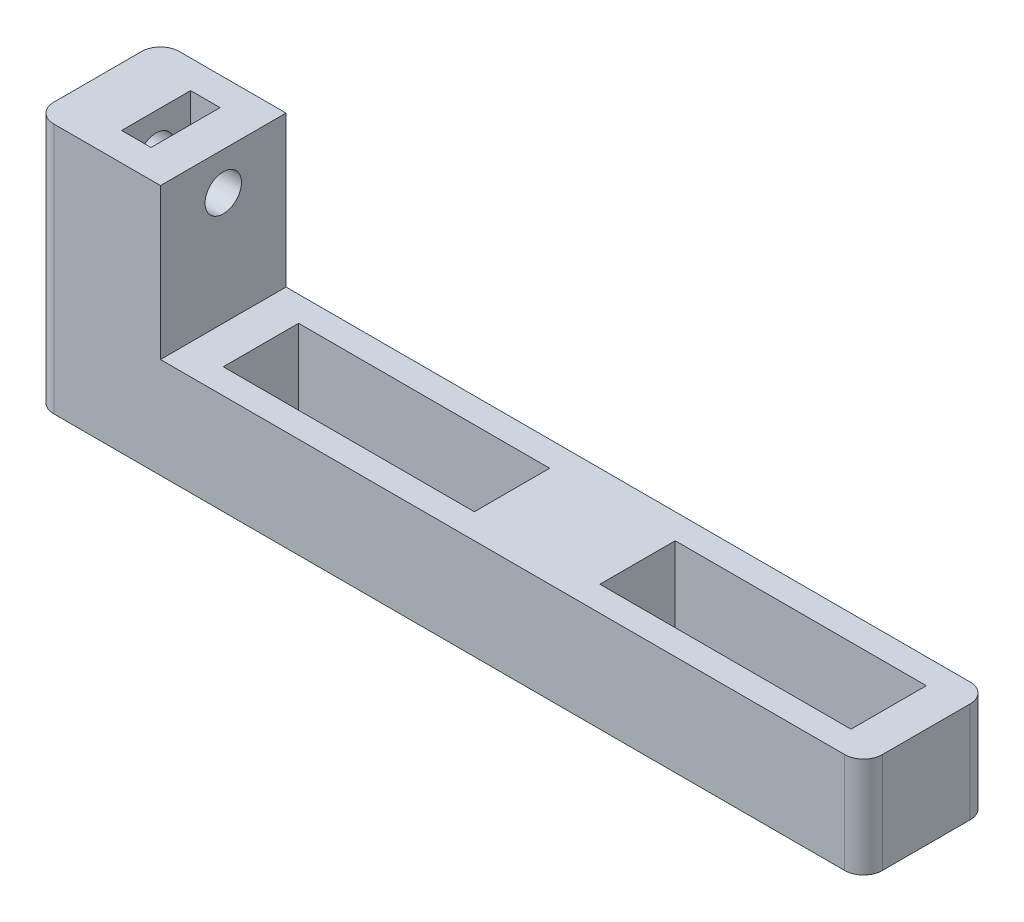
ISO-10303-21;
HEADER;
FILE_DESCRIPTION(('STEP AP214'),'2;1');
FILE_NAME('part.step','',(''),(''),'','','');
FILE_SCHEMA(('AUTOMOTIVE_DESIGN { 1 0 10303 214 1 1 1 1 }'));
ENDSEC;
DATA;
#1=APPLICATION_CONTEXT('core data for automotive mechanical design processes');
#2=APPLICATION_PROTOCOL_DEFINITION('international standard','automotive_design',2000,#1);
#3=PRODUCT_CONTEXT('',#1,'mechanical');
#4=PRODUCT('Part','Part','',(#3));
#5=PRODUCT_RELATED_PRODUCT_CATEGORY('part','',(#4));
#6=PRODUCT_DEFINITION_FORMATION('','',#4);
#7=PRODUCT_DEFINITION_CONTEXT('part definition',#1,'design');
#8=PRODUCT_DEFINITION('design','',#6,#7);
#9=PRODUCT_DEFINITION_SHAPE('','',#8);
#10=(LENGTH_UNIT() NAMED_UNIT(*) SI_UNIT(.MILLI.,.METRE.));
#11=(NAMED_UNIT(*) PLANE_ANGLE_UNIT() SI_UNIT($,.RADIAN.));
#12=(NAMED_UNIT(*) SI_UNIT($,.STERADIAN.) SOLID_ANGLE_UNIT());
#13=UNCERTAINTY_MEASURE_WITH_UNIT(LENGTH_MEASURE(1.E-05),#10,'distance_accuracy_value','');
#14=(GEOMETRIC_REPRESENTATION_CONTEXT(3) GLOBAL_UNCERTAINTY_ASSIGNED_CONTEXT((#13)) GLOBAL_UNIT_ASSIGNED_CONTEXT((#10,
#11,#12)) REPRESENTATION_CONTEXT('',''));
#15=CARTESIAN_POINT('',(0.,0.,0.));
#16=DIRECTION('',(0.,0.,1.));
#17=DIRECTION('',(1.,0.,0.));
#18=AXIS2_PLACEMENT_3D('',#15,#16,#17);
#19=CARTESIAN_POINT('',(-160.336548935054,20.5577990102229,5.));
#20=DIRECTION('',(1.,0.,0.));
#21=DIRECTION('',(0.,0.,-1.));
#22=AXIS2_PLACEMENT_3D('',#19,#20,#21);
#23=CYLINDRICAL_SURFACE('',#22,1.45);
#24=CARTESIAN_POINT('',(-153.336548935054,20.5577990102229,5.));
#25=DIRECTION('',(1.,0.,0.));
#26=DIRECTION('',(0.,0.,-1.));
#27=AXIS2_PLACEMENT_3D('',#24,#25,#26);
#28=CIRCLE('',#27,1.45);
#29=CARTESIAN_POINT('',(-153.336548935054,20.5577990102229,3.55));
#30=VERTEX_POINT('',#29);
#31=EDGE_CURVE('E37',#30,#30,#28,.F.);
#32=ORIENTED_EDGE('',*,*,#31,.T.);
#33=EDGE_LOOP('',(#32));
#34=FACE_BOUND('',#33,.T.);
#35=CARTESIAN_POINT('',(-150.336548935054,20.5577990102229,5.));
#36=DIRECTION('',(1.,0.,0.));
#37=DIRECTION('',(0.,0.,-1.));
#38=AXIS2_PLACEMENT_3D('',#35,#36,#37);
#39=CIRCLE('',#38,1.45);
#40=CARTESIAN_POINT('',(-150.336548935054,20.5577990102229,3.55));
#41=VERTEX_POINT('',#40);
#42=EDGE_CURVE('E275',#41,#41,#39,.T.);
#43=ORIENTED_EDGE('',*,*,#42,.T.);
#44=EDGE_LOOP('',(#43));
#45=FACE_BOUND('',#44,.T.);
#46=ADVANCED_FACE('F33',(#34,#45),#23,.F.);
#47=CARTESIAN_POINT('',(-150.336548935054,23.5577990102229,10.));
#48=DIRECTION('',(0.,-1.,0.));
#49=DIRECTION('',(0.,0.,-1.));
#50=AXIS2_PLACEMENT_3D('',#47,#48,#49);
#51=PLANE('',#50);
#52=DIRECTION('',(-1.,0.,0.));
#53=VECTOR('',#52,1.);
#54=CARTESIAN_POINT('',(-153.336548935054,23.5577990102229,2.25));
#55=LINE('',#54,#53);
#56=CARTESIAN_POINT('',(-153.336548935054,23.5577990102229,2.25));
#57=VERTEX_POINT('',#56);
#58=CARTESIAN_POINT('',(-155.686548935054,23.5577990102229,2.25));
#59=VERTEX_POINT('',#58);
#60=EDGE_CURVE('E261',#57,#59,#55,.T.);
#61=ORIENTED_EDGE('',*,*,#60,.F.);
#62=DIRECTION('',(0.,0.,-1.));
#63=VECTOR('',#62,1.);
#64=CARTESIAN_POINT('',(-153.336548935054,23.5577990102229,2.25));
#65=LINE('',#64,#63);
#66=CARTESIAN_POINT('',(-153.336548935054,23.5577990102229,7.75));
#67=VERTEX_POINT('',#66);
#68=EDGE_CURVE('E50',#67,#57,#65,.T.);
#69=ORIENTED_EDGE('',*,*,#68,.F.);
#70=DIRECTION('',(1.,0.,0.));
#71=VECTOR('',#70,1.);
#72=CARTESIAN_POINT('',(-153.336548935054,23.5577990102229,7.75));
#73=LINE('',#72,#71);
#74=CARTESIAN_POINT('',(-155.686548935054,23.5577990102229,7.75));
#75=VERTEX_POINT('',#74);
#76=EDGE_CURVE('E252',#75,#67,#73,.T.);
#77=ORIENTED_EDGE('',*,*,#76,.F.);
#78=DIRECTION('',(0.,0.,1.));
#79=VECTOR('',#78,1.);
#80=CARTESIAN_POINT('',(-155.686548935054,23.5577990102229,2.25));
#81=LINE('',#80,#79);
#82=EDGE_CURVE('E255',#59,#75,#81,.T.);
#83=ORIENTED_EDGE('',*,*,#82,.F.);
#84=EDGE_LOOP('',(#61,#69,#77,#83));
#85=FACE_BOUND('',#84,.T.);
#86=DIRECTION('',(-1.,0.,0.));
#87=VECTOR('',#86,1.);
#88=CARTESIAN_POINT('',(-150.336548935054,23.5577990102229,0.));
#89=LINE('',#88,#87);
#90=CARTESIAN_POINT('',(-150.336548935054,23.5577990102229,0.));
#91=VERTEX_POINT('',#90);
#92=CARTESIAN_POINT('',(-158.836548935054,23.5577990102229,0.));
#93=VERTEX_POINT('',#92);
#94=EDGE_CURVE('E397',#91,#93,#89,.T.);
#95=ORIENTED_EDGE('',*,*,#94,.T.);
#96=CARTESIAN_POINT('',(-158.836548935054,23.5577990102229,1.5));
#97=DIRECTION('',(0.,-1.,0.));
#98=DIRECTION('',(0.,0.,-1.));
#99=AXIS2_PLACEMENT_3D('',#96,#97,#98);
#100=CIRCLE('',#99,1.5);
#101=CARTESIAN_POINT('',(-160.336548935054,23.5577990102229,1.5));
#102=VERTEX_POINT('',#101);
#103=EDGE_CURVE('E11',#93,#102,#100,.F.);
#104=ORIENTED_EDGE('',*,*,#103,.T.);
#105=DIRECTION('',(0.,0.,-1.));
#106=VECTOR('',#105,1.);
#107=CARTESIAN_POINT('',(-160.336548935054,23.5577990102229,10.));
#108=LINE('',#107,#106);
#109=CARTESIAN_POINT('',(-160.336548935054,23.5577990102229,8.5));
#110=VERTEX_POINT('',#109);
#111=EDGE_CURVE('E438',#110,#102,#108,.T.);
#112=ORIENTED_EDGE('',*,*,#111,.F.);
#113=CARTESIAN_POINT('',(-158.836548935054,23.5577990102229,8.5));
#114=DIRECTION('',(0.,-1.,0.));
#115=DIRECTION('',(0.,0.,-1.));
#116=AXIS2_PLACEMENT_3D('',#113,#114,#115);
#117=CIRCLE('',#116,1.5);
#118=CARTESIAN_POINT('',(-158.836548935054,23.5577990102229,10.));
#119=VERTEX_POINT('',#118);
#120=EDGE_CURVE('E42',#110,#119,#117,.F.);
#121=ORIENTED_EDGE('',*,*,#120,.T.);
#122=DIRECTION('',(-1.,0.,0.));
#123=VECTOR('',#122,1.);
#124=CARTESIAN_POINT('',(-150.336548935054,23.5577990102229,10.));
#125=LINE('',#124,#123);
#126=CARTESIAN_POINT('',(-150.336548935054,23.5577990102229,10.));
#127=VERTEX_POINT('',#126);
#128=EDGE_CURVE('E404',#127,#119,#125,.T.);
#129=ORIENTED_EDGE('',*,*,#128,.F.);
#130=DIRECTION('',(0.,0.,-1.));
#131=VECTOR('',#130,1.);
#132=CARTESIAN_POINT('',(-150.336548935054,23.5577990102229,10.));
#133=LINE('',#132,#131);
#134=EDGE_CURVE('E415',#127,#91,#133,.T.);
#135=ORIENTED_EDGE('',*,*,#134,.T.);
#136=EDGE_LOOP('',(#95,#104,#112,#121,#129,#135));
#137=FACE_BOUND('',#136,.T.);
#138=ADVANCED_FACE('F495',(#85,#137),#51,.F.);
#139=CARTESIAN_POINT('',(-160.336548935054,23.5577990102229,10.));
#140=DIRECTION('',(1.,0.,0.));
#141=DIRECTION('',(0.,0.,-1.));
#142=AXIS2_PLACEMENT_3D('',#139,#140,#141);
#143=PLANE('',#142);
#144=CARTESIAN_POINT('',(-160.336548935054,20.5577990102229,5.));
#145=DIRECTION('',(1.,0.,0.));
#146=DIRECTION('',(0.,0.,-1.));
#147=AXIS2_PLACEMENT_3D('',#144,#145,#146);
#148=CIRCLE('',#147,1.45);
#149=CARTESIAN_POINT('',(-160.336548935054,20.5577990102229,3.55));
#150=VERTEX_POINT('',#149);
#151=EDGE_CURVE('E271',#150,#150,#148,.T.);
#152=ORIENTED_EDGE('',*,*,#151,.T.);
#153=EDGE_LOOP('',(#152));
#154=FACE_BOUND('',#153,.T.);
#155=ORIENTED_EDGE('',*,*,#111,.T.);
#156=DIRECTION('',(0.,-1.,0.));
#157=VECTOR('',#156,1.);
#158=CARTESIAN_POINT('',(-160.336548935054,23.5577990102229,1.5));
#159=LINE('',#158,#157);
#160=CARTESIAN_POINT('',(-160.336548935054,3.55779901022288,1.5));
#161=VERTEX_POINT('',#160);
#162=EDGE_CURVE('E470',#102,#161,#159,.T.);
#163=ORIENTED_EDGE('',*,*,#162,.T.);
#164=DIRECTION('',(0.,0.,-1.));
#165=VECTOR('',#164,1.);
#166=CARTESIAN_POINT('',(-160.336548935054,3.55779901022288,10.));
#167=LINE('',#166,#165);
#168=CARTESIAN_POINT('',(-160.336548935054,3.55779901022288,8.5));
#169=VERTEX_POINT('',#168);
#170=EDGE_CURVE('E435',#169,#161,#167,.T.);
#171=ORIENTED_EDGE('',*,*,#170,.F.);
#172=DIRECTION('',(0.,-1.,0.));
#173=VECTOR('',#172,1.);
#174=CARTESIAN_POINT('',(-160.336548935054,23.5577990102229,8.5));
#175=LINE('',#174,#173);
#176=EDGE_CURVE('E468',#169,#110,#175,.F.);
#177=ORIENTED_EDGE('',*,*,#176,.T.);
#178=EDGE_LOOP('',(#155,#163,#171,#177));
#179=FACE_BOUND('',#178,.T.);
#180=ADVANCED_FACE('F499',(#154,#179),#143,.F.);
#181=CARTESIAN_POINT('',(-160.336548935054,3.55779901022288,10.));
#182=DIRECTION('',(0.,1.,0.));
#183=DIRECTION('',(0.,0.,1.));
#184=AXIS2_PLACEMENT_3D('',#181,#182,#183);
#185=PLANE('',#184);
#186=DIRECTION('',(1.,0.,0.));
#187=VECTOR('',#186,1.);
#188=CARTESIAN_POINT('',(-146.336548935054,3.55779901022288,6.45));
#189=LINE('',#188,#187);
#190=CARTESIAN_POINT('',(-146.336548935054,3.55779901022288,6.45));
#191=VERTEX_POINT('',#190);
#192=CARTESIAN_POINT('',(-128.336548935054,3.55779901022288,6.45));
#193=VERTEX_POINT('',#192);
#194=EDGE_CURVE('E286',#191,#193,#189,.T.);
#195=ORIENTED_EDGE('',*,*,#194,.T.);
#196=DIRECTION('',(0.,0.,-1.));
#197=VECTOR('',#196,1.);
#198=CARTESIAN_POINT('',(-128.336548935054,3.55779901022288,3.5));
#199=LINE('',#198,#197);
#200=CARTESIAN_POINT('',(-128.336548935054,3.55779901022288,3.5));
#201=VERTEX_POINT('',#200);
#202=EDGE_CURVE('E278',#193,#201,#199,.T.);
#203=ORIENTED_EDGE('',*,*,#202,.T.);
#204=DIRECTION('',(-1.,0.,0.));
#205=VECTOR('',#204,1.);
#206=CARTESIAN_POINT('',(-146.336548935054,3.55779901022288,3.5));
#207=LINE('',#206,#205);
#208=CARTESIAN_POINT('',(-146.336548935054,3.55779901022288,3.5));
#209=VERTEX_POINT('',#208);
#210=EDGE_CURVE('E281',#201,#209,#207,.T.);
#211=ORIENTED_EDGE('',*,*,#210,.T.);
#212=DIRECTION('',(0.,0.,1.));
#213=VECTOR('',#212,1.);
#214=CARTESIAN_POINT('',(-146.336548935054,3.55779901022288,3.5));
#215=LINE('',#214,#213);
#216=EDGE_CURVE('E58',#209,#191,#215,.T.);
#217=ORIENTED_EDGE('',*,*,#216,.T.);
#218=EDGE_LOOP('',(#195,#203,#211,#217));
#219=FACE_BOUND('',#218,.T.);
#220=DIRECTION('',(1.,0.,0.));
#221=VECTOR('',#220,1.);
#222=CARTESIAN_POINT('',(-116.336548935054,3.55779901022288,6.45));
#223=LINE('',#222,#221);
#224=CARTESIAN_POINT('',(-116.336548935054,3.55779901022288,6.45));
#225=VERTEX_POINT('',#224);
#226=CARTESIAN_POINT('',(-98.3365489350536,3.55779901022288,6.45));
#227=VERTEX_POINT('',#226);
#228=EDGE_CURVE('E318',#225,#227,#223,.T.);
#229=ORIENTED_EDGE('',*,*,#228,.T.);
#230=DIRECTION('',(0.,0.,-1.));
#231=VECTOR('',#230,1.);
#232=CARTESIAN_POINT('',(-98.3365489350536,3.55779901022288,3.5));
#233=LINE('',#232,#231);
#234=CARTESIAN_POINT('',(-98.3365489350536,3.55779901022288,3.5));
#235=VERTEX_POINT('',#234);
#236=EDGE_CURVE('E308',#227,#235,#233,.T.);
#237=ORIENTED_EDGE('',*,*,#236,.T.);
#238=DIRECTION('',(-1.,0.,0.));
#239=VECTOR('',#238,1.);
#240=CARTESIAN_POINT('',(-116.336548935054,3.55779901022288,3.5));
#241=LINE('',#240,#239);
#242=CARTESIAN_POINT('',(-116.336548935054,3.55779901022288,3.5));
#243=VERTEX_POINT('',#242);
#244=EDGE_CURVE('E311',#235,#243,#241,.T.);
#245=ORIENTED_EDGE('',*,*,#244,.T.);
#246=DIRECTION('',(0.,0.,1.));
#247=VECTOR('',#246,1.);
#248=CARTESIAN_POINT('',(-116.336548935054,3.55779901022288,3.5));
#249=LINE('',#248,#247);
#250=EDGE_CURVE('E315',#243,#225,#249,.T.);
#251=ORIENTED_EDGE('',*,*,#250,.T.);
#252=EDGE_LOOP('',(#229,#237,#245,#251));
#253=FACE_BOUND('',#252,.T.);
#254=DIRECTION('',(1.,0.,0.));
#255=VECTOR('',#254,1.);
#256=CARTESIAN_POINT('',(-160.336548935054,3.55779901022288,0.));
#257=LINE('',#256,#255);
#258=CARTESIAN_POINT('',(-158.836548935054,3.55779901022288,0.));
#259=VERTEX_POINT('',#258);
#260=CARTESIAN_POINT('',(-95.8365489350536,3.55779901022288,0.));
#261=VERTEX_POINT('',#260);
#262=EDGE_CURVE('E418',#259,#261,#257,.T.);
#263=ORIENTED_EDGE('',*,*,#262,.T.);
#264=CARTESIAN_POINT('',(-95.8365489350536,3.55779901022288,1.5));
#265=DIRECTION('',(0.,1.,0.));
#266=DIRECTION('',(0.,0.,1.));
#267=AXIS2_PLACEMENT_3D('',#264,#265,#266);
#268=CIRCLE('',#267,1.5);
#269=CARTESIAN_POINT('',(-94.3365489350536,3.55779901022288,1.5));
#270=VERTEX_POINT('',#269);
#271=EDGE_CURVE('E460',#261,#270,#268,.F.);
#272=ORIENTED_EDGE('',*,*,#271,.T.);
#273=DIRECTION('',(0.,0.,-1.));
#274=VECTOR('',#273,1.);
#275=CARTESIAN_POINT('',(-94.3365489350536,3.55779901022288,10.));
#276=LINE('',#275,#274);
#277=CARTESIAN_POINT('',(-94.3365489350536,3.55779901022288,8.5));
#278=VERTEX_POINT('',#277);
#279=EDGE_CURVE('E432',#278,#270,#276,.T.);
#280=ORIENTED_EDGE('',*,*,#279,.F.);
#281=CARTESIAN_POINT('',(-95.8365489350536,3.55779901022288,8.5));
#282=DIRECTION('',(0.,1.,0.));
#283=DIRECTION('',(0.,0.,1.));
#284=AXIS2_PLACEMENT_3D('',#281,#282,#283);
#285=CIRCLE('',#284,1.5);
#286=CARTESIAN_POINT('',(-95.8365489350536,3.55779901022288,10.));
#287=VERTEX_POINT('',#286);
#288=EDGE_CURVE('E458',#278,#287,#285,.F.);
#289=ORIENTED_EDGE('',*,*,#288,.T.);
#290=DIRECTION('',(1.,0.,0.));
#291=VECTOR('',#290,1.);
#292=CARTESIAN_POINT('',(-160.336548935054,3.55779901022288,10.));
#293=LINE('',#292,#291);
#294=CARTESIAN_POINT('',(-158.836548935054,3.55779901022288,10.));
#295=VERTEX_POINT('',#294);
#296=EDGE_CURVE('E407',#295,#287,#293,.T.);
#297=ORIENTED_EDGE('',*,*,#296,.F.);
#298=CARTESIAN_POINT('',(-158.836548935054,3.55779901022288,8.5));
#299=DIRECTION('',(0.,1.,0.));
#300=DIRECTION('',(0.,0.,1.));
#301=AXIS2_PLACEMENT_3D('',#298,#299,#300);
#302=CIRCLE('',#301,1.5);
#303=EDGE_CURVE('E454',#295,#169,#302,.F.);
#304=ORIENTED_EDGE('',*,*,#303,.T.);
#305=ORIENTED_EDGE('',*,*,#170,.T.);
#306=CARTESIAN_POINT('',(-158.836548935054,3.55779901022288,1.5));
#307=DIRECTION('',(0.,1.,0.));
#308=DIRECTION('',(0.,0.,1.));
#309=AXIS2_PLACEMENT_3D('',#306,#307,#308);
#310=CIRCLE('',#309,1.5);
#311=EDGE_CURVE('E456',#161,#259,#310,.F.);
#312=ORIENTED_EDGE('',*,*,#311,.T.);
#313=EDGE_LOOP('',(#263,#272,#280,#289,#297,#304,#305,#312));
#314=FACE_BOUND('',#313,.T.);
#315=ADVANCED_FACE('F593',(#219,#253,#314),#185,.F.);
#316=CARTESIAN_POINT('',(-94.3365489350536,3.55779901022288,10.));
#317=DIRECTION('',(-1.,0.,0.));
#318=DIRECTION('',(0.,0.,1.));
#319=AXIS2_PLACEMENT_3D('',#316,#317,#318);
#320=PLANE('',#319);
#321=ORIENTED_EDGE('',*,*,#279,.T.);
#322=DIRECTION('',(0.,1.,0.));
#323=VECTOR('',#322,1.);
#324=CARTESIAN_POINT('',(-94.3365489350536,3.55779901022288,1.5));
#325=LINE('',#324,#323);
#326=CARTESIAN_POINT('',(-94.3365489350536,11.5577990102229,1.5));
#327=VERTEX_POINT('',#326);
#328=EDGE_CURVE('E443',#270,#327,#325,.T.);
#329=ORIENTED_EDGE('',*,*,#328,.T.);
#330=DIRECTION('',(0.,0.,-1.));
#331=VECTOR('',#330,1.);
#332=CARTESIAN_POINT('',(-94.3365489350536,11.5577990102229,10.));
#333=LINE('',#332,#331);
#334=CARTESIAN_POINT('',(-94.3365489350536,11.5577990102229,8.5));
#335=VERTEX_POINT('',#334);
#336=EDGE_CURVE('E429',#335,#327,#333,.T.);
#337=ORIENTED_EDGE('',*,*,#336,.F.);
#338=DIRECTION('',(0.,1.,0.));
#339=VECTOR('',#338,1.);
#340=CARTESIAN_POINT('',(-94.3365489350536,3.55779901022288,8.5));
#341=LINE('',#340,#339);
#342=EDGE_CURVE('E441',#335,#278,#341,.F.);
#343=ORIENTED_EDGE('',*,*,#342,.T.);
#344=EDGE_LOOP('',(#321,#329,#337,#343));
#345=FACE_BOUND('',#344,.T.);
#346=ADVANCED_FACE('F589',(#345),#320,.F.);
#347=CARTESIAN_POINT('',(-94.3365489350536,11.5577990102229,10.));
#348=DIRECTION('',(0.,-1.,0.));
#349=DIRECTION('',(1.,0.,0.));
#350=AXIS2_PLACEMENT_3D('',#347,#348,#349);
#351=PLANE('',#350);
#352=DIRECTION('',(-1.,0.,0.));
#353=VECTOR('',#352,1.);
#354=CARTESIAN_POINT('',(-127.336548935054,11.5577990102229,2.));
#355=LINE('',#354,#353);
#356=CARTESIAN_POINT('',(-127.336548935054,11.5577990102229,2.));
#357=VERTEX_POINT('',#356);
#358=CARTESIAN_POINT('',(-147.336548935054,11.5577990102229,2.));
#359=VERTEX_POINT('',#358);
#360=EDGE_CURVE('E355',#357,#359,#355,.T.);
#361=ORIENTED_EDGE('',*,*,#360,.F.);
#362=DIRECTION('',(0.,0.,-1.));
#363=VECTOR('',#362,1.);
#364=CARTESIAN_POINT('',(-127.336548935054,11.5577990102229,2.));
#365=LINE('',#364,#363);
#366=CARTESIAN_POINT('',(-127.336548935054,11.5577990102229,8.));
#367=VERTEX_POINT('',#366);
#368=EDGE_CURVE('E333',#367,#357,#365,.T.);
#369=ORIENTED_EDGE('',*,*,#368,.F.);
#370=DIRECTION('',(1.,0.,0.));
#371=VECTOR('',#370,1.);
#372=CARTESIAN_POINT('',(-127.336548935054,11.5577990102229,8.));
#373=LINE('',#372,#371);
#374=CARTESIAN_POINT('',(-147.336548935054,11.5577990102229,8.));
#375=VERTEX_POINT('',#374);
#376=EDGE_CURVE('E344',#375,#367,#373,.T.);
#377=ORIENTED_EDGE('',*,*,#376,.F.);
#378=DIRECTION('',(0.,0.,1.));
#379=VECTOR('',#378,1.);
#380=CARTESIAN_POINT('',(-147.336548935054,11.5577990102229,2.));
#381=LINE('',#380,#379);
#382=EDGE_CURVE('E358',#359,#375,#381,.T.);
#383=ORIENTED_EDGE('',*,*,#382,.F.);
#384=EDGE_LOOP('',(#361,#369,#377,#383));
#385=FACE_BOUND('',#384,.T.);
#386=DIRECTION('',(-1.,0.,0.));
#387=VECTOR('',#386,1.);
#388=CARTESIAN_POINT('',(-97.3365489350536,11.5577990102229,2.));
#389=LINE('',#388,#387);
#390=CARTESIAN_POINT('',(-97.3365489350536,11.5577990102229,2.));
#391=VERTEX_POINT('',#390);
#392=CARTESIAN_POINT('',(-117.336548935054,11.5577990102229,2.));
#393=VERTEX_POINT('',#392);
#394=EDGE_CURVE('E387',#391,#393,#389,.T.);
#395=ORIENTED_EDGE('',*,*,#394,.F.);
#396=DIRECTION('',(0.,0.,-1.));
#397=VECTOR('',#396,1.);
#398=CARTESIAN_POINT('',(-97.3365489350536,11.5577990102229,2.));
#399=LINE('',#398,#397);
#400=CARTESIAN_POINT('',(-97.3365489350536,11.5577990102229,8.));
#401=VERTEX_POINT('',#400);
#402=EDGE_CURVE('E365',#401,#391,#399,.T.);
#403=ORIENTED_EDGE('',*,*,#402,.F.);
#404=DIRECTION('',(1.,0.,0.));
#405=VECTOR('',#404,1.);
#406=CARTESIAN_POINT('',(-97.3365489350536,11.5577990102229,8.));
#407=LINE('',#406,#405);
#408=CARTESIAN_POINT('',(-117.336548935054,11.5577990102229,8.));
#409=VERTEX_POINT('',#408);
#410=EDGE_CURVE('E376',#409,#401,#407,.T.);
#411=ORIENTED_EDGE('',*,*,#410,.F.);
#412=DIRECTION('',(0.,0.,1.));
#413=VECTOR('',#412,1.);
#414=CARTESIAN_POINT('',(-117.336548935054,11.5577990102229,2.));
#415=LINE('',#414,#413);
#416=EDGE_CURVE('E390',#393,#409,#415,.T.);
#417=ORIENTED_EDGE('',*,*,#416,.F.);
#418=EDGE_LOOP('',(#395,#403,#411,#417));
#419=FACE_BOUND('',#418,.T.);
#420=ORIENTED_EDGE('',*,*,#336,.T.);
#421=CARTESIAN_POINT('',(-95.8365489350536,11.5577990102229,1.5));
#422=DIRECTION('',(0.,-1.,0.));
#423=DIRECTION('',(1.,0.,0.));
#424=AXIS2_PLACEMENT_3D('',#421,#422,#423);
#425=CIRCLE('',#424,1.5);
#426=CARTESIAN_POINT('',(-95.8365489350536,11.5577990102229,0.));
#427=VERTEX_POINT('',#426);
#428=EDGE_CURVE('E448',#327,#427,#425,.F.);
#429=ORIENTED_EDGE('',*,*,#428,.T.);
#430=DIRECTION('',(-1.,0.,0.));
#431=VECTOR('',#430,1.);
#432=CARTESIAN_POINT('',(-94.3365489350536,11.5577990102229,0.));
#433=LINE('',#432,#431);
#434=CARTESIAN_POINT('',(-150.336548935054,11.5577990102229,0.));
#435=VERTEX_POINT('',#434);
#436=EDGE_CURVE('E421',#427,#435,#433,.T.);
#437=ORIENTED_EDGE('',*,*,#436,.T.);
#438=DIRECTION('',(0.,0.,-1.));
#439=VECTOR('',#438,1.);
#440=CARTESIAN_POINT('',(-150.336548935054,11.5577990102229,10.));
#441=LINE('',#440,#439);
#442=CARTESIAN_POINT('',(-150.336548935054,11.5577990102229,10.));
#443=VERTEX_POINT('',#442);
#444=EDGE_CURVE('E426',#443,#435,#441,.T.);
#445=ORIENTED_EDGE('',*,*,#444,.F.);
#446=DIRECTION('',(-1.,0.,0.));
#447=VECTOR('',#446,1.);
#448=CARTESIAN_POINT('',(-94.3365489350536,11.5577990102229,10.));
#449=LINE('',#448,#447);
#450=CARTESIAN_POINT('',(-95.8365489350536,11.5577990102229,10.));
#451=VERTEX_POINT('',#450);
#452=EDGE_CURVE('E411',#451,#443,#449,.T.);
#453=ORIENTED_EDGE('',*,*,#452,.F.);
#454=CARTESIAN_POINT('',(-95.8365489350536,11.5577990102229,8.5));
#455=DIRECTION('',(0.,-1.,0.));
#456=DIRECTION('',(1.,0.,0.));
#457=AXIS2_PLACEMENT_3D('',#454,#455,#456);
#458=CIRCLE('',#457,1.5);
#459=EDGE_CURVE('E446',#451,#335,#458,.F.);
#460=ORIENTED_EDGE('',*,*,#459,.T.);
#461=EDGE_LOOP('',(#420,#429,#437,#445,#453,#460));
#462=FACE_BOUND('',#461,.T.);
#463=ADVANCED_FACE('F585',(#385,#419,#462),#351,.F.);
#464=CARTESIAN_POINT('',(-150.336548935054,11.5577990102229,10.));
#465=DIRECTION('',(-1.,0.,0.));
#466=DIRECTION('',(0.,0.,1.));
#467=AXIS2_PLACEMENT_3D('',#464,#465,#466);
#468=PLANE('',#467);
#469=ORIENTED_EDGE('',*,*,#42,.F.);
#470=EDGE_LOOP('',(#469));
#471=FACE_BOUND('',#470,.T.);
#472=DIRECTION('',(0.,1.,0.));
#473=VECTOR('',#472,1.);
#474=CARTESIAN_POINT('',(-150.336548935054,11.5577990102229,0.));
#475=LINE('',#474,#473);
#476=EDGE_CURVE('E408',#435,#91,#475,.T.);
#477=ORIENTED_EDGE('',*,*,#476,.T.);
#478=ORIENTED_EDGE('',*,*,#134,.F.);
#479=DIRECTION('',(0.,1.,0.));
#480=VECTOR('',#479,1.);
#481=CARTESIAN_POINT('',(-150.336548935054,11.5577990102229,10.));
#482=LINE('',#481,#480);
#483=EDGE_CURVE('E413',#443,#127,#482,.T.);
#484=ORIENTED_EDGE('',*,*,#483,.F.);
#485=ORIENTED_EDGE('',*,*,#444,.T.);
#486=EDGE_LOOP('',(#477,#478,#484,#485));
#487=FACE_BOUND('',#486,.T.);
#488=ADVANCED_FACE('F577',(#471,#487),#468,.F.);
#489=CARTESIAN_POINT('',(0.,0.,10.));
#490=DIRECTION('',(0.,0.,1.));
#491=DIRECTION('',(1.,0.,0.));
#492=AXIS2_PLACEMENT_3D('',#489,#490,#491);
#493=PLANE('',#492);
#494=ORIENTED_EDGE('',*,*,#296,.T.);
#495=DIRECTION('',(0.,1.,0.));
#496=VECTOR('',#495,1.);
#497=CARTESIAN_POINT('',(-95.8365489350536,11.5577990102229,10.));
#498=LINE('',#497,#496);
#499=EDGE_CURVE('E465',#287,#451,#498,.T.);
#500=ORIENTED_EDGE('',*,*,#499,.T.);
#501=ORIENTED_EDGE('',*,*,#452,.T.);
#502=ORIENTED_EDGE('',*,*,#483,.T.);
#503=ORIENTED_EDGE('',*,*,#128,.T.);
#504=DIRECTION('',(0.,-1.,0.));
#505=VECTOR('',#504,1.);
#506=CARTESIAN_POINT('',(-158.836548935054,3.55779901022288,10.));
#507=LINE('',#506,#505);
#508=EDGE_CURVE('E462',#119,#295,#507,.T.);
#509=ORIENTED_EDGE('',*,*,#508,.T.);
#510=EDGE_LOOP('',(#494,#500,#501,#502,#503,#509));
#511=FACE_BOUND('',#510,.T.);
#512=ADVANCED_FACE('F573',(#511),#493,.T.);
#513=CARTESIAN_POINT('',(0.,0.,0.));
#514=DIRECTION('',(0.,0.,1.));
#515=DIRECTION('',(1.,0.,0.));
#516=AXIS2_PLACEMENT_3D('',#513,#514,#515);
#517=PLANE('',#516);
#518=ORIENTED_EDGE('',*,*,#436,.F.);
#519=DIRECTION('',(0.,1.,0.));
#520=VECTOR('',#519,1.);
#521=CARTESIAN_POINT('',(-95.8365489350536,0.,0.));
#522=LINE('',#521,#520);
#523=EDGE_CURVE('E452',#427,#261,#522,.F.);
#524=ORIENTED_EDGE('',*,*,#523,.T.);
#525=ORIENTED_EDGE('',*,*,#262,.F.);
#526=DIRECTION('',(0.,-1.,0.));
#527=VECTOR('',#526,1.);
#528=CARTESIAN_POINT('',(-158.836548935054,0.,0.));
#529=LINE('',#528,#527);
#530=EDGE_CURVE('E450',#259,#93,#529,.F.);
#531=ORIENTED_EDGE('',*,*,#530,.T.);
#532=ORIENTED_EDGE('',*,*,#94,.F.);
#533=ORIENTED_EDGE('',*,*,#476,.F.);
#534=EDGE_LOOP('',(#518,#524,#525,#531,#532,#533));
#535=FACE_BOUND('',#534,.T.);
#536=ADVANCED_FACE('F576',(#535),#517,.F.);
#537=CARTESIAN_POINT('',(-95.8365489350536,3.55779901022288,1.5));
#538=DIRECTION('',(0.,1.,0.));
#539=DIRECTION('',(0.,0.,1.));
#540=AXIS2_PLACEMENT_3D('',#537,#538,#539);
#541=CYLINDRICAL_SURFACE('',#540,1.5);
#542=ORIENTED_EDGE('',*,*,#271,.F.);
#543=ORIENTED_EDGE('',*,*,#523,.F.);
#544=ORIENTED_EDGE('',*,*,#428,.F.);
#545=ORIENTED_EDGE('',*,*,#328,.F.);
#546=EDGE_LOOP('',(#542,#543,#544,#545));
#547=FACE_BOUND('',#546,.T.);
#548=ADVANCED_FACE('F581',(#547),#541,.T.);
#549=CARTESIAN_POINT('',(-95.8365489350536,0.,8.5));
#550=DIRECTION('',(0.,-1.,0.));
#551=DIRECTION('',(0.,0.,-1.));
#552=AXIS2_PLACEMENT_3D('',#549,#550,#551);
#553=CYLINDRICAL_SURFACE('',#552,1.5);
#554=ORIENTED_EDGE('',*,*,#288,.F.);
#555=ORIENTED_EDGE('',*,*,#342,.F.);
#556=ORIENTED_EDGE('',*,*,#459,.F.);
#557=ORIENTED_EDGE('',*,*,#499,.F.);
#558=EDGE_LOOP('',(#554,#555,#556,#557));
#559=FACE_BOUND('',#558,.T.);
#560=ADVANCED_FACE('F603',(#559),#553,.T.);
#561=CARTESIAN_POINT('',(-158.836548935054,23.5577990102229,1.5));
#562=DIRECTION('',(0.,-1.,0.));
#563=DIRECTION('',(0.,0.,-1.));
#564=AXIS2_PLACEMENT_3D('',#561,#562,#563);
#565=CYLINDRICAL_SURFACE('',#564,1.5);
#566=ORIENTED_EDGE('',*,*,#103,.F.);
#567=ORIENTED_EDGE('',*,*,#530,.F.);
#568=ORIENTED_EDGE('',*,*,#311,.F.);
#569=ORIENTED_EDGE('',*,*,#162,.F.);
#570=EDGE_LOOP('',(#566,#567,#568,#569));
#571=FACE_BOUND('',#570,.T.);
#572=ADVANCED_FACE('F606',(#571),#565,.T.);
#573=CARTESIAN_POINT('',(-158.836548935054,0.,8.5));
#574=DIRECTION('',(0.,1.,0.));
#575=DIRECTION('',(0.,0.,1.));
#576=AXIS2_PLACEMENT_3D('',#573,#574,#575);
#577=CYLINDRICAL_SURFACE('',#576,1.5);
#578=ORIENTED_EDGE('',*,*,#120,.F.);
#579=ORIENTED_EDGE('',*,*,#176,.F.);
#580=ORIENTED_EDGE('',*,*,#303,.F.);
#581=ORIENTED_EDGE('',*,*,#508,.F.);
#582=EDGE_LOOP('',(#578,#579,#580,#581));
#583=FACE_BOUND('',#582,.T.);
#584=ADVANCED_FACE('F35',(#583),#577,.T.);
#585=CARTESIAN_POINT('',(-97.3365489350536,5.05779901022288,2.));
#586=DIRECTION('',(1.,0.,0.));
#587=DIRECTION('',(0.,1.,0.));
#588=AXIS2_PLACEMENT_3D('',#585,#586,#587);
#589=PLANE('',#588);
#590=ORIENTED_EDGE('',*,*,#402,.T.);
#591=DIRECTION('',(0.,1.,0.));
#592=VECTOR('',#591,1.);
#593=CARTESIAN_POINT('',(-97.3365489350536,5.05779901022288,2.));
#594=LINE('',#593,#592);
#595=CARTESIAN_POINT('',(-97.3365489350536,5.05779901022288,2.));
#596=VERTEX_POINT('',#595);
#597=EDGE_CURVE('E385',#596,#391,#594,.T.);
#598=ORIENTED_EDGE('',*,*,#597,.F.);
#599=DIRECTION('',(0.,0.,-1.));
#600=VECTOR('',#599,1.);
#601=CARTESIAN_POINT('',(-97.3365489350536,5.05779901022288,2.));
#602=LINE('',#601,#600);
#603=CARTESIAN_POINT('',(-97.3365489350536,5.05779901022288,8.));
#604=VERTEX_POINT('',#603);
#605=EDGE_CURVE('E372',#604,#596,#602,.T.);
#606=ORIENTED_EDGE('',*,*,#605,.F.);
#607=DIRECTION('',(0.,1.,0.));
#608=VECTOR('',#607,1.);
#609=CARTESIAN_POINT('',(-97.3365489350536,5.05779901022288,8.));
#610=LINE('',#609,#608);
#611=EDGE_CURVE('E395',#604,#401,#610,.T.);
#612=ORIENTED_EDGE('',*,*,#611,.T.);
#613=EDGE_LOOP('',(#590,#598,#606,#612));
#614=FACE_BOUND('',#613,.T.);
#615=ADVANCED_FACE('F562',(#614),#589,.F.);
#616=CARTESIAN_POINT('',(-97.3365489350536,5.05779901022288,8.));
#617=DIRECTION('',(0.,0.,1.));
#618=DIRECTION('',(1.,0.,0.));
#619=AXIS2_PLACEMENT_3D('',#616,#617,#618);
#620=PLANE('',#619);
#621=ORIENTED_EDGE('',*,*,#410,.T.);
#622=ORIENTED_EDGE('',*,*,#611,.F.);
#623=DIRECTION('',(1.,0.,0.));
#624=VECTOR('',#623,1.);
#625=CARTESIAN_POINT('',(-97.3365489350536,5.05779901022288,8.));
#626=LINE('',#625,#624);
#627=CARTESIAN_POINT('',(-117.336548935054,5.05779901022288,8.));
#628=VERTEX_POINT('',#627);
#629=EDGE_CURVE('E382',#628,#604,#626,.T.);
#630=ORIENTED_EDGE('',*,*,#629,.F.);
#631=DIRECTION('',(0.,1.,0.));
#632=VECTOR('',#631,1.);
#633=CARTESIAN_POINT('',(-117.336548935054,5.05779901022288,8.));
#634=LINE('',#633,#632);
#635=EDGE_CURVE('E398',#628,#409,#634,.T.);
#636=ORIENTED_EDGE('',*,*,#635,.T.);
#637=EDGE_LOOP('',(#621,#622,#630,#636));
#638=FACE_BOUND('',#637,.T.);
#639=ADVANCED_FACE('F558',(#638),#620,.F.);
#640=CARTESIAN_POINT('',(-117.336548935054,5.05779901022288,2.));
#641=DIRECTION('',(-1.,0.,0.));
#642=DIRECTION('',(0.,-1.,0.));
#643=AXIS2_PLACEMENT_3D('',#640,#641,#642);
#644=PLANE('',#643);
#645=ORIENTED_EDGE('',*,*,#416,.T.);
#646=ORIENTED_EDGE('',*,*,#635,.F.);
#647=DIRECTION('',(0.,0.,1.));
#648=VECTOR('',#647,1.);
#649=CARTESIAN_POINT('',(-117.336548935054,5.05779901022288,2.));
#650=LINE('',#649,#648);
#651=CARTESIAN_POINT('',(-117.336548935054,5.05779901022288,2.));
#652=VERTEX_POINT('',#651);
#653=EDGE_CURVE('E379',#652,#628,#650,.T.);
#654=ORIENTED_EDGE('',*,*,#653,.F.);
#655=DIRECTION('',(0.,1.,0.));
#656=VECTOR('',#655,1.);
#657=CARTESIAN_POINT('',(-117.336548935054,5.05779901022288,2.));
#658=LINE('',#657,#656);
#659=EDGE_CURVE('E400',#652,#393,#658,.T.);
#660=ORIENTED_EDGE('',*,*,#659,.T.);
#661=EDGE_LOOP('',(#645,#646,#654,#660));
#662=FACE_BOUND('',#661,.T.);
#663=ADVANCED_FACE('F561',(#662),#644,.F.);
#664=CARTESIAN_POINT('',(-97.3365489350536,5.05779901022288,2.));
#665=DIRECTION('',(0.,0.,-1.));
#666=DIRECTION('',(-1.,0.,0.));
#667=AXIS2_PLACEMENT_3D('',#664,#665,#666);
#668=PLANE('',#667);
#669=ORIENTED_EDGE('',*,*,#394,.T.);
#670=ORIENTED_EDGE('',*,*,#659,.F.);
#671=DIRECTION('',(-1.,0.,0.));
#672=VECTOR('',#671,1.);
#673=CARTESIAN_POINT('',(-97.3365489350536,5.05779901022288,2.));
#674=LINE('',#673,#672);
#675=EDGE_CURVE('E375',#596,#652,#674,.T.);
#676=ORIENTED_EDGE('',*,*,#675,.F.);
#677=ORIENTED_EDGE('',*,*,#597,.T.);
#678=EDGE_LOOP('',(#669,#670,#676,#677));
#679=FACE_BOUND('',#678,.T.);
#680=ADVANCED_FACE('F556',(#679),#668,.F.);
#681=CARTESIAN_POINT('',(0.,5.05779901022289,0.));
#682=DIRECTION('',(0.,-1.,0.));
#683=DIRECTION('',(1.,0.,0.));
#684=AXIS2_PLACEMENT_3D('',#681,#682,#683);
#685=PLANE('',#684);
#686=DIRECTION('',(-1.,0.,0.));
#687=VECTOR('',#686,1.);
#688=CARTESIAN_POINT('',(-116.336548935054,5.05779901022288,3.5));
#689=LINE('',#688,#687);
#690=CARTESIAN_POINT('',(-98.3365489350536,5.05779901022288,3.5));
#691=VERTEX_POINT('',#690);
#692=CARTESIAN_POINT('',(-116.336548935054,5.05779901022288,3.5));
#693=VERTEX_POINT('',#692);
#694=EDGE_CURVE('E323',#691,#693,#689,.T.);
#695=ORIENTED_EDGE('',*,*,#694,.F.);
#696=DIRECTION('',(0.,0.,-1.));
#697=VECTOR('',#696,1.);
#698=CARTESIAN_POINT('',(-98.3365489350536,5.05779901022288,3.5));
#699=LINE('',#698,#697);
#700=CARTESIAN_POINT('',(-98.3365489350536,5.05779901022288,6.45));
#701=VERTEX_POINT('',#700);
#702=EDGE_CURVE('E301',#701,#691,#699,.T.);
#703=ORIENTED_EDGE('',*,*,#702,.F.);
#704=DIRECTION('',(1.,0.,0.));
#705=VECTOR('',#704,1.);
#706=CARTESIAN_POINT('',(-116.336548935054,5.05779901022288,6.45));
#707=LINE('',#706,#705);
#708=CARTESIAN_POINT('',(-116.336548935054,5.05779901022288,6.45));
#709=VERTEX_POINT('',#708);
#710=EDGE_CURVE('E312',#709,#701,#707,.T.);
#711=ORIENTED_EDGE('',*,*,#710,.F.);
#712=DIRECTION('',(0.,0.,1.));
#713=VECTOR('',#712,1.);
#714=CARTESIAN_POINT('',(-116.336548935054,5.05779901022288,3.5));
#715=LINE('',#714,#713);
#716=EDGE_CURVE('E326',#693,#709,#715,.T.);
#717=ORIENTED_EDGE('',*,*,#716,.F.);
#718=EDGE_LOOP('',(#695,#703,#711,#717));
#719=FACE_BOUND('',#718,.T.);
#720=ORIENTED_EDGE('',*,*,#605,.T.);
#721=ORIENTED_EDGE('',*,*,#675,.T.);
#722=ORIENTED_EDGE('',*,*,#653,.T.);
#723=ORIENTED_EDGE('',*,*,#629,.T.);
#724=EDGE_LOOP('',(#720,#721,#722,#723));
#725=FACE_BOUND('',#724,.T.);
#726=ADVANCED_FACE('F552',(#719,#725),#685,.F.);
#727=CARTESIAN_POINT('',(-127.336548935054,5.05779901022288,2.));
#728=DIRECTION('',(1.,0.,0.));
#729=DIRECTION('',(0.,1.,0.));
#730=AXIS2_PLACEMENT_3D('',#727,#728,#729);
#731=PLANE('',#730);
#732=ORIENTED_EDGE('',*,*,#368,.T.);
#733=DIRECTION('',(0.,1.,0.));
#734=VECTOR('',#733,1.);
#735=CARTESIAN_POINT('',(-127.336548935054,5.05779901022288,2.));
#736=LINE('',#735,#734);
#737=CARTESIAN_POINT('',(-127.336548935054,5.05779901022288,2.));
#738=VERTEX_POINT('',#737);
#739=EDGE_CURVE('E353',#738,#357,#736,.T.);
#740=ORIENTED_EDGE('',*,*,#739,.F.);
#741=DIRECTION('',(0.,0.,-1.));
#742=VECTOR('',#741,1.);
#743=CARTESIAN_POINT('',(-127.336548935054,5.05779901022288,2.));
#744=LINE('',#743,#742);
#745=CARTESIAN_POINT('',(-127.336548935054,5.05779901022288,8.));
#746=VERTEX_POINT('',#745);
#747=EDGE_CURVE('E340',#746,#738,#744,.T.);
#748=ORIENTED_EDGE('',*,*,#747,.F.);
#749=DIRECTION('',(0.,1.,0.));
#750=VECTOR('',#749,1.);
#751=CARTESIAN_POINT('',(-127.336548935054,5.05779901022288,8.));
#752=LINE('',#751,#750);
#753=EDGE_CURVE('E363',#746,#367,#752,.T.);
#754=ORIENTED_EDGE('',*,*,#753,.T.);
#755=EDGE_LOOP('',(#732,#740,#748,#754));
#756=FACE_BOUND('',#755,.T.);
#757=ADVANCED_FACE('F542',(#756),#731,.F.);
#758=CARTESIAN_POINT('',(-127.336548935054,5.05779901022288,8.));
#759=DIRECTION('',(0.,0.,1.));
#760=DIRECTION('',(1.,0.,0.));
#761=AXIS2_PLACEMENT_3D('',#758,#759,#760);
#762=PLANE('',#761);
#763=ORIENTED_EDGE('',*,*,#376,.T.);
#764=ORIENTED_EDGE('',*,*,#753,.F.);
#765=DIRECTION('',(1.,0.,0.));
#766=VECTOR('',#765,1.);
#767=CARTESIAN_POINT('',(-127.336548935054,5.05779901022288,8.));
#768=LINE('',#767,#766);
#769=CARTESIAN_POINT('',(-147.336548935054,5.05779901022287,8.));
#770=VERTEX_POINT('',#769);
#771=EDGE_CURVE('E350',#770,#746,#768,.T.);
#772=ORIENTED_EDGE('',*,*,#771,.F.);
#773=DIRECTION('',(0.,1.,0.));
#774=VECTOR('',#773,1.);
#775=CARTESIAN_POINT('',(-147.336548935054,5.05779901022287,8.));
#776=LINE('',#775,#774);
#777=EDGE_CURVE('E366',#770,#375,#776,.T.);
#778=ORIENTED_EDGE('',*,*,#777,.T.);
#779=EDGE_LOOP('',(#763,#764,#772,#778));
#780=FACE_BOUND('',#779,.T.);
#781=ADVANCED_FACE('F538',(#780),#762,.F.);
#782=CARTESIAN_POINT('',(-147.336548935054,5.05779901022287,2.));
#783=DIRECTION('',(-1.,0.,0.));
#784=DIRECTION('',(0.,-1.,0.));
#785=AXIS2_PLACEMENT_3D('',#782,#783,#784);
#786=PLANE('',#785);
#787=ORIENTED_EDGE('',*,*,#382,.T.);
#788=ORIENTED_EDGE('',*,*,#777,.F.);
#789=DIRECTION('',(0.,0.,1.));
#790=VECTOR('',#789,1.);
#791=CARTESIAN_POINT('',(-147.336548935054,5.05779901022287,2.));
#792=LINE('',#791,#790);
#793=CARTESIAN_POINT('',(-147.336548935054,5.05779901022287,2.));
#794=VERTEX_POINT('',#793);
#795=EDGE_CURVE('E347',#794,#770,#792,.T.);
#796=ORIENTED_EDGE('',*,*,#795,.F.);
#797=DIRECTION('',(0.,1.,0.));
#798=VECTOR('',#797,1.);
#799=CARTESIAN_POINT('',(-147.336548935054,5.05779901022287,2.));
#800=LINE('',#799,#798);
#801=EDGE_CURVE('E368',#794,#359,#800,.T.);
#802=ORIENTED_EDGE('',*,*,#801,.T.);
#803=EDGE_LOOP('',(#787,#788,#796,#802));
#804=FACE_BOUND('',#803,.T.);
#805=ADVANCED_FACE('F541',(#804),#786,.F.);
#806=CARTESIAN_POINT('',(-127.336548935054,5.05779901022288,2.));
#807=DIRECTION('',(0.,0.,-1.));
#808=DIRECTION('',(-1.,0.,0.));
#809=AXIS2_PLACEMENT_3D('',#806,#807,#808);
#810=PLANE('',#809);
#811=ORIENTED_EDGE('',*,*,#360,.T.);
#812=ORIENTED_EDGE('',*,*,#801,.F.);
#813=DIRECTION('',(-1.,0.,0.));
#814=VECTOR('',#813,1.);
#815=CARTESIAN_POINT('',(-127.336548935054,5.05779901022288,2.));
#816=LINE('',#815,#814);
#817=EDGE_CURVE('E343',#738,#794,#816,.T.);
#818=ORIENTED_EDGE('',*,*,#817,.F.);
#819=ORIENTED_EDGE('',*,*,#739,.T.);
#820=EDGE_LOOP('',(#811,#812,#818,#819));
#821=FACE_BOUND('',#820,.T.);
#822=ADVANCED_FACE('F536',(#821),#810,.F.);
#823=CARTESIAN_POINT('',(0.,5.0577990102229,0.));
#824=DIRECTION('',(0.,-1.,0.));
#825=DIRECTION('',(1.,0.,0.));
#826=AXIS2_PLACEMENT_3D('',#823,#824,#825);
#827=PLANE('',#826);
#828=DIRECTION('',(-1.,0.,0.));
#829=VECTOR('',#828,1.);
#830=CARTESIAN_POINT('',(-146.336548935054,5.05779901022287,3.5));
#831=LINE('',#830,#829);
#832=CARTESIAN_POINT('',(-128.336548935054,5.05779901022288,3.5));
#833=VERTEX_POINT('',#832);
#834=CARTESIAN_POINT('',(-146.336548935054,5.05779901022287,3.5));
#835=VERTEX_POINT('',#834);
#836=EDGE_CURVE('E291',#833,#835,#831,.T.);
#837=ORIENTED_EDGE('',*,*,#836,.F.);
#838=DIRECTION('',(0.,0.,-1.));
#839=VECTOR('',#838,1.);
#840=CARTESIAN_POINT('',(-128.336548935054,5.05779901022288,3.5));
#841=LINE('',#840,#839);
#842=CARTESIAN_POINT('',(-128.336548935054,5.05779901022288,6.45));
#843=VERTEX_POINT('',#842);
#844=EDGE_CURVE('E274',#843,#833,#841,.T.);
#845=ORIENTED_EDGE('',*,*,#844,.F.);
#846=DIRECTION('',(1.,0.,0.));
#847=VECTOR('',#846,1.);
#848=CARTESIAN_POINT('',(-146.336548935054,5.05779901022287,6.45));
#849=LINE('',#848,#847);
#850=CARTESIAN_POINT('',(-146.336548935054,5.05779901022287,6.45));
#851=VERTEX_POINT('',#850);
#852=EDGE_CURVE('E282',#851,#843,#849,.T.);
#853=ORIENTED_EDGE('',*,*,#852,.F.);
#854=DIRECTION('',(0.,0.,1.));
#855=VECTOR('',#854,1.);
#856=CARTESIAN_POINT('',(-146.336548935054,5.05779901022287,3.5));
#857=LINE('',#856,#855);
#858=EDGE_CURVE('E294',#835,#851,#857,.T.);
#859=ORIENTED_EDGE('',*,*,#858,.F.);
#860=EDGE_LOOP('',(#837,#845,#853,#859));
#861=FACE_BOUND('',#860,.T.);
#862=ORIENTED_EDGE('',*,*,#747,.T.);
#863=ORIENTED_EDGE('',*,*,#817,.T.);
#864=ORIENTED_EDGE('',*,*,#795,.T.);
#865=ORIENTED_EDGE('',*,*,#771,.T.);
#866=EDGE_LOOP('',(#862,#863,#864,#865));
#867=FACE_BOUND('',#866,.T.);
#868=ADVANCED_FACE('F532',(#861,#867),#827,.F.);
#869=CARTESIAN_POINT('',(-98.3365489350536,3.55779901022288,3.5));
#870=DIRECTION('',(1.,0.,0.));
#871=DIRECTION('',(0.,1.,0.));
#872=AXIS2_PLACEMENT_3D('',#869,#870,#871);
#873=PLANE('',#872);
#874=ORIENTED_EDGE('',*,*,#702,.T.);
#875=DIRECTION('',(0.,1.,0.));
#876=VECTOR('',#875,1.);
#877=CARTESIAN_POINT('',(-98.3365489350536,3.55779901022288,3.5));
#878=LINE('',#877,#876);
#879=EDGE_CURVE('E321',#235,#691,#878,.T.);
#880=ORIENTED_EDGE('',*,*,#879,.F.);
#881=ORIENTED_EDGE('',*,*,#236,.F.);
#882=DIRECTION('',(0.,1.,0.));
#883=VECTOR('',#882,1.);
#884=CARTESIAN_POINT('',(-98.3365489350536,3.55779901022288,6.45));
#885=LINE('',#884,#883);
#886=EDGE_CURVE('E331',#227,#701,#885,.T.);
#887=ORIENTED_EDGE('',*,*,#886,.T.);
#888=EDGE_LOOP('',(#874,#880,#881,#887));
#889=FACE_BOUND('',#888,.T.);
#890=ADVANCED_FACE('F522',(#889),#873,.F.);
#891=CARTESIAN_POINT('',(-116.336548935054,3.55779901022288,6.45));
#892=DIRECTION('',(0.,0.,1.));
#893=DIRECTION('',(1.,0.,0.));
#894=AXIS2_PLACEMENT_3D('',#891,#892,#893);
#895=PLANE('',#894);
#896=ORIENTED_EDGE('',*,*,#710,.T.);
#897=ORIENTED_EDGE('',*,*,#886,.F.);
#898=ORIENTED_EDGE('',*,*,#228,.F.);
#899=DIRECTION('',(0.,1.,0.));
#900=VECTOR('',#899,1.);
#901=CARTESIAN_POINT('',(-116.336548935054,3.55779901022288,6.45));
#902=LINE('',#901,#900);
#903=EDGE_CURVE('E334',#225,#709,#902,.T.);
#904=ORIENTED_EDGE('',*,*,#903,.T.);
#905=EDGE_LOOP('',(#896,#897,#898,#904));
#906=FACE_BOUND('',#905,.T.);
#907=ADVANCED_FACE('F518',(#906),#895,.F.);
#908=CARTESIAN_POINT('',(-116.336548935054,3.55779901022288,3.5));
#909=DIRECTION('',(-1.,0.,0.));
#910=DIRECTION('',(0.,-1.,0.));
#911=AXIS2_PLACEMENT_3D('',#908,#909,#910);
#912=PLANE('',#911);
#913=ORIENTED_EDGE('',*,*,#716,.T.);
#914=ORIENTED_EDGE('',*,*,#903,.F.);
#915=ORIENTED_EDGE('',*,*,#250,.F.);
#916=DIRECTION('',(0.,1.,0.));
#917=VECTOR('',#916,1.);
#918=CARTESIAN_POINT('',(-116.336548935054,3.55779901022288,3.5));
#919=LINE('',#918,#917);
#920=EDGE_CURVE('E336',#243,#693,#919,.T.);
#921=ORIENTED_EDGE('',*,*,#920,.T.);
#922=EDGE_LOOP('',(#913,#914,#915,#921));
#923=FACE_BOUND('',#922,.T.);
#924=ADVANCED_FACE('F521',(#923),#912,.F.);
#925=CARTESIAN_POINT('',(-116.336548935054,3.55779901022288,3.5));
#926=DIRECTION('',(0.,0.,-1.));
#927=DIRECTION('',(-1.,0.,0.));
#928=AXIS2_PLACEMENT_3D('',#925,#926,#927);
#929=PLANE('',#928);
#930=ORIENTED_EDGE('',*,*,#694,.T.);
#931=ORIENTED_EDGE('',*,*,#920,.F.);
#932=ORIENTED_EDGE('',*,*,#244,.F.);
#933=ORIENTED_EDGE('',*,*,#879,.T.);
#934=EDGE_LOOP('',(#930,#931,#932,#933));
#935=FACE_BOUND('',#934,.T.);
#936=ADVANCED_FACE('F516',(#935),#929,.F.);
#937=CARTESIAN_POINT('',(-128.336548935054,3.55779901022288,3.5));
#938=DIRECTION('',(1.,0.,0.));
#939=DIRECTION('',(0.,1.,0.));
#940=AXIS2_PLACEMENT_3D('',#937,#938,#939);
#941=PLANE('',#940);
#942=ORIENTED_EDGE('',*,*,#844,.T.);
#943=DIRECTION('',(0.,1.,0.));
#944=VECTOR('',#943,1.);
#945=CARTESIAN_POINT('',(-128.336548935054,3.55779901022288,3.5));
#946=LINE('',#945,#944);
#947=EDGE_CURVE('E289',#201,#833,#946,.T.);
#948=ORIENTED_EDGE('',*,*,#947,.F.);
#949=ORIENTED_EDGE('',*,*,#202,.F.);
#950=DIRECTION('',(0.,1.,0.));
#951=VECTOR('',#950,1.);
#952=CARTESIAN_POINT('',(-128.336548935054,3.55779901022288,6.45));
#953=LINE('',#952,#951);
#954=EDGE_CURVE('E299',#193,#843,#953,.T.);
#955=ORIENTED_EDGE('',*,*,#954,.T.);
#956=EDGE_LOOP('',(#942,#948,#949,#955));
#957=FACE_BOUND('',#956,.T.);
#958=ADVANCED_FACE('F507',(#957),#941,.F.);
#959=CARTESIAN_POINT('',(-146.336548935054,3.55779901022288,6.45));
#960=DIRECTION('',(0.,0.,1.));
#961=DIRECTION('',(1.,0.,0.));
#962=AXIS2_PLACEMENT_3D('',#959,#960,#961);
#963=PLANE('',#962);
#964=ORIENTED_EDGE('',*,*,#852,.T.);
#965=ORIENTED_EDGE('',*,*,#954,.F.);
#966=ORIENTED_EDGE('',*,*,#194,.F.);
#967=DIRECTION('',(0.,1.,0.));
#968=VECTOR('',#967,1.);
#969=CARTESIAN_POINT('',(-146.336548935054,3.55779901022288,6.45));
#970=LINE('',#969,#968);
#971=EDGE_CURVE('E302',#191,#851,#970,.T.);
#972=ORIENTED_EDGE('',*,*,#971,.T.);
#973=EDGE_LOOP('',(#964,#965,#966,#972));
#974=FACE_BOUND('',#973,.T.);
#975=ADVANCED_FACE('F503',(#974),#963,.F.);
#976=CARTESIAN_POINT('',(-146.336548935054,3.55779901022288,3.5));
#977=DIRECTION('',(-1.,0.,0.));
#978=DIRECTION('',(0.,-1.,0.));
#979=AXIS2_PLACEMENT_3D('',#976,#977,#978);
#980=PLANE('',#979);
#981=ORIENTED_EDGE('',*,*,#858,.T.);
#982=ORIENTED_EDGE('',*,*,#971,.F.);
#983=ORIENTED_EDGE('',*,*,#216,.F.);
#984=DIRECTION('',(0.,1.,0.));
#985=VECTOR('',#984,1.);
#986=CARTESIAN_POINT('',(-146.336548935054,3.55779901022288,3.5));
#987=LINE('',#986,#985);
#988=EDGE_CURVE('E304',#209,#835,#987,.T.);
#989=ORIENTED_EDGE('',*,*,#988,.T.);
#990=EDGE_LOOP('',(#981,#982,#983,#989));
#991=FACE_BOUND('',#990,.T.);
#992=ADVANCED_FACE('F506',(#991),#980,.F.);
#993=CARTESIAN_POINT('',(-146.336548935054,3.55779901022288,3.5));
#994=DIRECTION('',(0.,0.,-1.));
#995=DIRECTION('',(-1.,0.,0.));
#996=AXIS2_PLACEMENT_3D('',#993,#994,#995);
#997=PLANE('',#996);
#998=ORIENTED_EDGE('',*,*,#836,.T.);
#999=ORIENTED_EDGE('',*,*,#988,.F.);
#1000=ORIENTED_EDGE('',*,*,#210,.F.);
#1001=ORIENTED_EDGE('',*,*,#947,.T.);
#1002=EDGE_LOOP('',(#998,#999,#1000,#1001));
#1003=FACE_BOUND('',#1002,.T.);
#1004=ADVANCED_FACE('F491',(#1003),#997,.F.);
#1005=CARTESIAN_POINT('',(-155.686548935054,20.5577990102229,5.));
#1006=DIRECTION('',(-1.,0.,0.));
#1007=DIRECTION('',(0.,0.,1.));
#1008=AXIS2_PLACEMENT_3D('',#1005,#1006,#1007);
#1009=CIRCLE('',#1008,1.45);
#1010=CARTESIAN_POINT('',(-155.686548935054,20.5577990102229,6.45));
#1011=VERTEX_POINT('',#1010);
#1012=EDGE_CURVE('E267',#1011,#1011,#1009,.F.);
#1013=ORIENTED_EDGE('',*,*,#1012,.T.);
#1014=EDGE_LOOP('',(#1013));
#1015=FACE_BOUND('',#1014,.T.);
#1016=ORIENTED_EDGE('',*,*,#151,.F.);
#1017=EDGE_LOOP('',(#1016));
#1018=FACE_BOUND('',#1017,.T.);
#1019=ADVANCED_FACE('F482',(#1015,#1018),#23,.F.);
#1020=CARTESIAN_POINT('',(-153.336548935054,17.5577990102229,2.25));
#1021=DIRECTION('',(1.,0.,0.));
#1022=DIRECTION('',(0.,0.,-1.));
#1023=AXIS2_PLACEMENT_3D('',#1020,#1021,#1022);
#1024=PLANE('',#1023);
#1025=ORIENTED_EDGE('',*,*,#68,.T.);
#1026=DIRECTION('',(0.,1.,0.));
#1027=VECTOR('',#1026,1.);
#1028=CARTESIAN_POINT('',(-153.336548935054,17.5577990102229,2.25));
#1029=LINE('',#1028,#1027);
#1030=CARTESIAN_POINT('',(-153.336548935054,17.5577990102229,2.25));
#1031=VERTEX_POINT('',#1030);
#1032=EDGE_CURVE('E229',#1031,#57,#1029,.T.);
#1033=ORIENTED_EDGE('',*,*,#1032,.F.);
#1034=DIRECTION('',(0.,0.,-1.));
#1035=VECTOR('',#1034,1.);
#1036=CARTESIAN_POINT('',(-153.336548935054,17.5577990102229,2.25));
#1037=LINE('',#1036,#1035);
#1038=CARTESIAN_POINT('',(-153.336548935054,17.5577990102229,7.75));
#1039=VERTEX_POINT('',#1038);
#1040=EDGE_CURVE('E234',#1039,#1031,#1037,.T.);
#1041=ORIENTED_EDGE('',*,*,#1040,.F.);
#1042=DIRECTION('',(0.,1.,0.));
#1043=VECTOR('',#1042,1.);
#1044=CARTESIAN_POINT('',(-153.336548935054,17.5577990102229,7.75));
#1045=LINE('',#1044,#1043);
#1046=EDGE_CURVE('E265',#1039,#67,#1045,.T.);
#1047=ORIENTED_EDGE('',*,*,#1046,.T.);
#1048=EDGE_LOOP('',(#1025,#1033,#1041,#1047));
#1049=FACE_BOUND('',#1048,.T.);
#1050=ORIENTED_EDGE('',*,*,#31,.F.);
#1051=EDGE_LOOP('',(#1050));
#1052=FACE_BOUND('',#1051,.T.);
#1053=ADVANCED_FACE('F231',(#1049,#1052),#1024,.F.);
#1054=CARTESIAN_POINT('',(-155.686548935054,17.5577990102229,2.25));
#1055=DIRECTION('',(-1.,0.,0.));
#1056=DIRECTION('',(0.,0.,1.));
#1057=AXIS2_PLACEMENT_3D('',#1054,#1055,#1056);
#1058=PLANE('',#1057);
#1059=ORIENTED_EDGE('',*,*,#82,.T.);
#1060=DIRECTION('',(0.,1.,0.));
#1061=VECTOR('',#1060,1.);
#1062=CARTESIAN_POINT('',(-155.686548935054,17.5577990102229,7.75));
#1063=LINE('',#1062,#1061);
#1064=CARTESIAN_POINT('',(-155.686548935054,17.5577990102229,7.75));
#1065=VERTEX_POINT('',#1064);
#1066=EDGE_CURVE('E268',#1065,#75,#1063,.T.);
#1067=ORIENTED_EDGE('',*,*,#1066,.F.);
#1068=DIRECTION('',(0.,0.,1.));
#1069=VECTOR('',#1068,1.);
#1070=CARTESIAN_POINT('',(-155.686548935054,17.5577990102229,2.25));
#1071=LINE('',#1070,#1069);
#1072=CARTESIAN_POINT('',(-155.686548935054,17.5577990102229,2.25));
#1073=VERTEX_POINT('',#1072);
#1074=EDGE_CURVE('E248',#1073,#1065,#1071,.T.);
#1075=ORIENTED_EDGE('',*,*,#1074,.F.);
#1076=DIRECTION('',(0.,1.,0.));
#1077=VECTOR('',#1076,1.);
#1078=CARTESIAN_POINT('',(-155.686548935054,17.5577990102229,2.25));
#1079=LINE('',#1078,#1077);
#1080=EDGE_CURVE('E239',#1073,#59,#1079,.T.);
#1081=ORIENTED_EDGE('',*,*,#1080,.T.);
#1082=EDGE_LOOP('',(#1059,#1067,#1075,#1081));
#1083=FACE_BOUND('',#1082,.T.);
#1084=ORIENTED_EDGE('',*,*,#1012,.F.);
#1085=EDGE_LOOP('',(#1084));
#1086=FACE_BOUND('',#1085,.T.);
#1087=ADVANCED_FACE('F481',(#1083,#1086),#1058,.F.);
#1088=CARTESIAN_POINT('',(-153.336548935054,17.5577990102229,7.75));
#1089=DIRECTION('',(0.,0.,1.));
#1090=DIRECTION('',(1.,0.,0.));
#1091=AXIS2_PLACEMENT_3D('',#1088,#1089,#1090);
#1092=PLANE('',#1091);
#1093=ORIENTED_EDGE('',*,*,#76,.T.);
#1094=ORIENTED_EDGE('',*,*,#1046,.F.);
#1095=DIRECTION('',(1.,0.,0.));
#1096=VECTOR('',#1095,1.);
#1097=CARTESIAN_POINT('',(-153.336548935054,17.5577990102229,7.75));
#1098=LINE('',#1097,#1096);
#1099=EDGE_CURVE('E240',#1065,#1039,#1098,.T.);
#1100=ORIENTED_EDGE('',*,*,#1099,.F.);
#1101=ORIENTED_EDGE('',*,*,#1066,.T.);
#1102=EDGE_LOOP('',(#1093,#1094,#1100,#1101));
#1103=FACE_BOUND('',#1102,.T.);
#1104=ADVANCED_FACE('F488',(#1103),#1092,.F.);
#1105=CARTESIAN_POINT('',(-153.336548935054,17.5577990102229,2.25));
#1106=DIRECTION('',(0.,0.,-1.));
#1107=DIRECTION('',(-1.,0.,0.));
#1108=AXIS2_PLACEMENT_3D('',#1105,#1106,#1107);
#1109=PLANE('',#1108);
#1110=ORIENTED_EDGE('',*,*,#60,.T.);
#1111=ORIENTED_EDGE('',*,*,#1080,.F.);
#1112=DIRECTION('',(-1.,0.,0.));
#1113=VECTOR('',#1112,1.);
#1114=CARTESIAN_POINT('',(-153.336548935054,17.5577990102229,2.25));
#1115=LINE('',#1114,#1113);
#1116=EDGE_CURVE('E243',#1031,#1073,#1115,.T.);
#1117=ORIENTED_EDGE('',*,*,#1116,.F.);
#1118=ORIENTED_EDGE('',*,*,#1032,.T.);
#1119=EDGE_LOOP('',(#1110,#1111,#1117,#1118));
#1120=FACE_BOUND('',#1119,.T.);
#1121=ADVANCED_FACE('F244',(#1120),#1109,.F.);
#1122=CARTESIAN_POINT('',(0.,17.5577990102229,0.));
#1123=DIRECTION('',(0.,-1.,0.));
#1124=DIRECTION('',(0.,0.,-1.));
#1125=AXIS2_PLACEMENT_3D('',#1122,#1123,#1124);
#1126=PLANE('',#1125);
#1127=ORIENTED_EDGE('',*,*,#1040,.T.);
#1128=ORIENTED_EDGE('',*,*,#1116,.T.);
#1129=ORIENTED_EDGE('',*,*,#1074,.T.);
#1130=ORIENTED_EDGE('',*,*,#1099,.T.);
#1131=EDGE_LOOP('',(#1127,#1128,#1129,#1130));
#1132=FACE_BOUND('',#1131,.T.);
#1133=ADVANCED_FACE('F250',(#1132),#1126,.F.);
#1134=CLOSED_SHELL('',(#46,#138,#180,#315,#346,#463,#488,#512,#536,#548,#560,#572,#584,#615,
#639,#663,#680,#726,#757,#781,#805,#822,#868,#890,#907,#924,#936,#958,#975,#992,#1004,#1019,
#1053,#1087,#1104,#1121,#1133));
#1135=MANIFOLD_SOLID_BREP('B2',#1134);
#1136=ADVANCED_BREP_SHAPE_REPRESENTATION('',(#18,#1135),#14);
#1137=SHAPE_DEFINITION_REPRESENTATION(#9,#1136);
ENDSEC;
END-ISO-10303-21;
